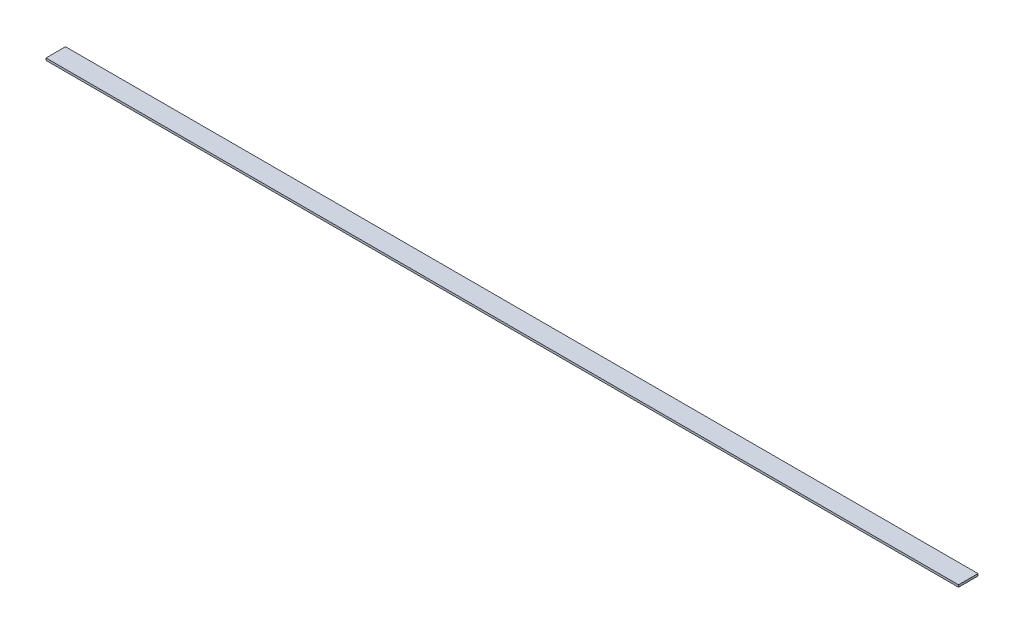
ISO-10303-21;
HEADER;
FILE_DESCRIPTION(('STEP AP214'),'2;1');
FILE_NAME('part.step','',(''),(''),'','','');
FILE_SCHEMA(('AUTOMOTIVE_DESIGN { 1 0 10303 214 1 1 1 1 }'));
ENDSEC;
DATA;
#1=APPLICATION_CONTEXT('core data for automotive mechanical design processes');
#2=APPLICATION_PROTOCOL_DEFINITION('international standard','automotive_design',2000,#1);
#3=PRODUCT_CONTEXT('',#1,'mechanical');
#4=PRODUCT('Part','Part','',(#3));
#5=PRODUCT_RELATED_PRODUCT_CATEGORY('part','',(#4));
#6=PRODUCT_DEFINITION_FORMATION('','',#4);
#7=PRODUCT_DEFINITION_CONTEXT('part definition',#1,'design');
#8=PRODUCT_DEFINITION('design','',#6,#7);
#9=PRODUCT_DEFINITION_SHAPE('','',#8);
#10=(LENGTH_UNIT() NAMED_UNIT(*) SI_UNIT(.MILLI.,.METRE.));
#11=(NAMED_UNIT(*) PLANE_ANGLE_UNIT() SI_UNIT($,.RADIAN.));
#12=(NAMED_UNIT(*) SI_UNIT($,.STERADIAN.) SOLID_ANGLE_UNIT());
#13=UNCERTAINTY_MEASURE_WITH_UNIT(LENGTH_MEASURE(1.E-05),#10,'distance_accuracy_value','');
#14=(GEOMETRIC_REPRESENTATION_CONTEXT(3) GLOBAL_UNCERTAINTY_ASSIGNED_CONTEXT((#13)) GLOBAL_UNIT_ASSIGNED_CONTEXT((#10,
#11,#12)) REPRESENTATION_CONTEXT('',''));
#15=CARTESIAN_POINT('',(0.,0.,0.));
#16=DIRECTION('',(0.,0.,1.));
#17=DIRECTION('',(1.,0.,0.));
#18=AXIS2_PLACEMENT_3D('',#15,#16,#17);
#19=CARTESIAN_POINT('',(527.5,2.5,-11.25));
#20=DIRECTION('',(-1.,0.,0.));
#21=DIRECTION('',(0.,0.,1.));
#22=AXIS2_PLACEMENT_3D('',#19,#20,#21);
#23=PLANE('',#22);
#24=DIRECTION('',(0.,0.,-1.));
#25=VECTOR('',#24,1.);
#26=CARTESIAN_POINT('',(527.5,0.,-11.25));
#27=LINE('',#26,#25);
#28=CARTESIAN_POINT('',(527.5,0.,11.25));
#29=VERTEX_POINT('',#28);
#30=CARTESIAN_POINT('',(527.5,0.,-11.25));
#31=VERTEX_POINT('',#30);
#32=EDGE_CURVE('E96',#29,#31,#27,.T.);
#33=ORIENTED_EDGE('',*,*,#32,.T.);
#34=DIRECTION('',(0.,-1.,0.));
#35=VECTOR('',#34,1.);
#36=CARTESIAN_POINT('',(527.5,2.5,-11.25));
#37=LINE('',#36,#35);
#38=CARTESIAN_POINT('',(527.5,2.5,-11.25));
#39=VERTEX_POINT('',#38);
#40=EDGE_CURVE('E11',#39,#31,#37,.T.);
#41=ORIENTED_EDGE('',*,*,#40,.F.);
#42=DIRECTION('',(0.,0.,-1.));
#43=VECTOR('',#42,1.);
#44=CARTESIAN_POINT('',(527.5,2.5,-11.25));
#45=LINE('',#44,#43);
#46=CARTESIAN_POINT('',(527.5,2.5,11.25));
#47=VERTEX_POINT('',#46);
#48=EDGE_CURVE('E84',#47,#39,#45,.T.);
#49=ORIENTED_EDGE('',*,*,#48,.F.);
#50=DIRECTION('',(0.,-1.,0.));
#51=VECTOR('',#50,1.);
#52=CARTESIAN_POINT('',(527.5,2.5,11.25));
#53=LINE('',#52,#51);
#54=EDGE_CURVE('E92',#47,#29,#53,.T.);
#55=ORIENTED_EDGE('',*,*,#54,.T.);
#56=EDGE_LOOP('',(#33,#41,#49,#55));
#57=FACE_BOUND('',#56,.T.);
#58=ADVANCED_FACE('F33',(#57),#23,.F.);
#59=CARTESIAN_POINT('',(-527.5,2.5,-11.25));
#60=DIRECTION('',(0.,0.,1.));
#61=DIRECTION('',(1.,0.,0.));
#62=AXIS2_PLACEMENT_3D('',#59,#60,#61);
#63=PLANE('',#62);
#64=DIRECTION('',(-1.,0.,0.));
#65=VECTOR('',#64,1.);
#66=CARTESIAN_POINT('',(-527.5,0.,-11.25));
#67=LINE('',#66,#65);
#68=CARTESIAN_POINT('',(-527.5,0.,-11.25));
#69=VERTEX_POINT('',#68);
#70=EDGE_CURVE('E88',#31,#69,#67,.T.);
#71=ORIENTED_EDGE('',*,*,#70,.T.);
#72=DIRECTION('',(0.,-1.,0.));
#73=VECTOR('',#72,1.);
#74=CARTESIAN_POINT('',(-527.5,2.5,-11.25));
#75=LINE('',#74,#73);
#76=CARTESIAN_POINT('',(-527.5,2.5,-11.25));
#77=VERTEX_POINT('',#76);
#78=EDGE_CURVE('E41',#77,#69,#75,.T.);
#79=ORIENTED_EDGE('',*,*,#78,.F.);
#80=DIRECTION('',(-1.,0.,0.));
#81=VECTOR('',#80,1.);
#82=CARTESIAN_POINT('',(-527.5,2.5,-11.25));
#83=LINE('',#82,#81);
#84=EDGE_CURVE('E79',#39,#77,#83,.T.);
#85=ORIENTED_EDGE('',*,*,#84,.F.);
#86=ORIENTED_EDGE('',*,*,#40,.T.);
#87=EDGE_LOOP('',(#71,#79,#85,#86));
#88=FACE_BOUND('',#87,.T.);
#89=ADVANCED_FACE('F87',(#88),#63,.F.);
#90=CARTESIAN_POINT('',(-527.5,2.5,-11.25));
#91=DIRECTION('',(1.,0.,0.));
#92=DIRECTION('',(0.,0.,-1.));
#93=AXIS2_PLACEMENT_3D('',#90,#91,#92);
#94=PLANE('',#93);
#95=DIRECTION('',(0.,0.,1.));
#96=VECTOR('',#95,1.);
#97=CARTESIAN_POINT('',(-527.5,0.,-11.25));
#98=LINE('',#97,#96);
#99=CARTESIAN_POINT('',(-527.5,0.,11.25));
#100=VERTEX_POINT('',#99);
#101=EDGE_CURVE('E66',#69,#100,#98,.T.);
#102=ORIENTED_EDGE('',*,*,#101,.T.);
#103=DIRECTION('',(0.,-1.,0.));
#104=VECTOR('',#103,1.);
#105=CARTESIAN_POINT('',(-527.5,2.5,11.25));
#106=LINE('',#105,#104);
#107=CARTESIAN_POINT('',(-527.5,2.5,11.25));
#108=VERTEX_POINT('',#107);
#109=EDGE_CURVE('E89',#108,#100,#106,.T.);
#110=ORIENTED_EDGE('',*,*,#109,.F.);
#111=DIRECTION('',(0.,0.,1.));
#112=VECTOR('',#111,1.);
#113=CARTESIAN_POINT('',(-527.5,2.5,-11.25));
#114=LINE('',#113,#112);
#115=EDGE_CURVE('E82',#77,#108,#114,.T.);
#116=ORIENTED_EDGE('',*,*,#115,.F.);
#117=ORIENTED_EDGE('',*,*,#78,.T.);
#118=EDGE_LOOP('',(#102,#110,#116,#117));
#119=FACE_BOUND('',#118,.T.);
#120=ADVANCED_FACE('F90',(#119),#94,.F.);
#121=CARTESIAN_POINT('',(-527.5,2.5,11.25));
#122=DIRECTION('',(0.,0.,-1.));
#123=DIRECTION('',(-1.,0.,0.));
#124=AXIS2_PLACEMENT_3D('',#121,#122,#123);
#125=PLANE('',#124);
#126=DIRECTION('',(1.,0.,0.));
#127=VECTOR('',#126,1.);
#128=CARTESIAN_POINT('',(-527.5,0.,11.25));
#129=LINE('',#128,#127);
#130=EDGE_CURVE('E72',#100,#29,#129,.T.);
#131=ORIENTED_EDGE('',*,*,#130,.T.);
#132=ORIENTED_EDGE('',*,*,#54,.F.);
#133=DIRECTION('',(1.,0.,0.));
#134=VECTOR('',#133,1.);
#135=CARTESIAN_POINT('',(-527.5,2.5,11.25));
#136=LINE('',#135,#134);
#137=EDGE_CURVE('E49',#108,#47,#136,.T.);
#138=ORIENTED_EDGE('',*,*,#137,.F.);
#139=ORIENTED_EDGE('',*,*,#109,.T.);
#140=EDGE_LOOP('',(#131,#132,#138,#139));
#141=FACE_BOUND('',#140,.T.);
#142=ADVANCED_FACE('F103',(#141),#125,.F.);
#143=CARTESIAN_POINT('',(0.,2.5,0.));
#144=DIRECTION('',(0.,1.,0.));
#145=DIRECTION('',(0.,0.,1.));
#146=AXIS2_PLACEMENT_3D('',#143,#144,#145);
#147=PLANE('',#146);
#148=ORIENTED_EDGE('',*,*,#48,.T.);
#149=ORIENTED_EDGE('',*,*,#84,.T.);
#150=ORIENTED_EDGE('',*,*,#115,.T.);
#151=ORIENTED_EDGE('',*,*,#137,.T.);
#152=EDGE_LOOP('',(#148,#149,#150,#151));
#153=FACE_BOUND('',#152,.T.);
#154=ADVANCED_FACE('F80',(#153),#147,.T.);
#155=CARTESIAN_POINT('',(0.,0.,0.));
#156=DIRECTION('',(0.,1.,0.));
#157=DIRECTION('',(0.,0.,1.));
#158=AXIS2_PLACEMENT_3D('',#155,#156,#157);
#159=PLANE('',#158);
#160=ORIENTED_EDGE('',*,*,#32,.F.);
#161=ORIENTED_EDGE('',*,*,#130,.F.);
#162=ORIENTED_EDGE('',*,*,#101,.F.);
#163=ORIENTED_EDGE('',*,*,#70,.F.);
#164=EDGE_LOOP('',(#160,#161,#162,#163));
#165=FACE_BOUND('',#164,.T.);
#166=ADVANCED_FACE('F106',(#165),#159,.F.);
#167=CLOSED_SHELL('',(#58,#89,#120,#142,#154,#166));
#168=MANIFOLD_SOLID_BREP('B2',#167);
#169=ADVANCED_BREP_SHAPE_REPRESENTATION('',(#18,#168),#14);
#170=SHAPE_DEFINITION_REPRESENTATION(#9,#169);
ENDSEC;
END-ISO-10303-21;
